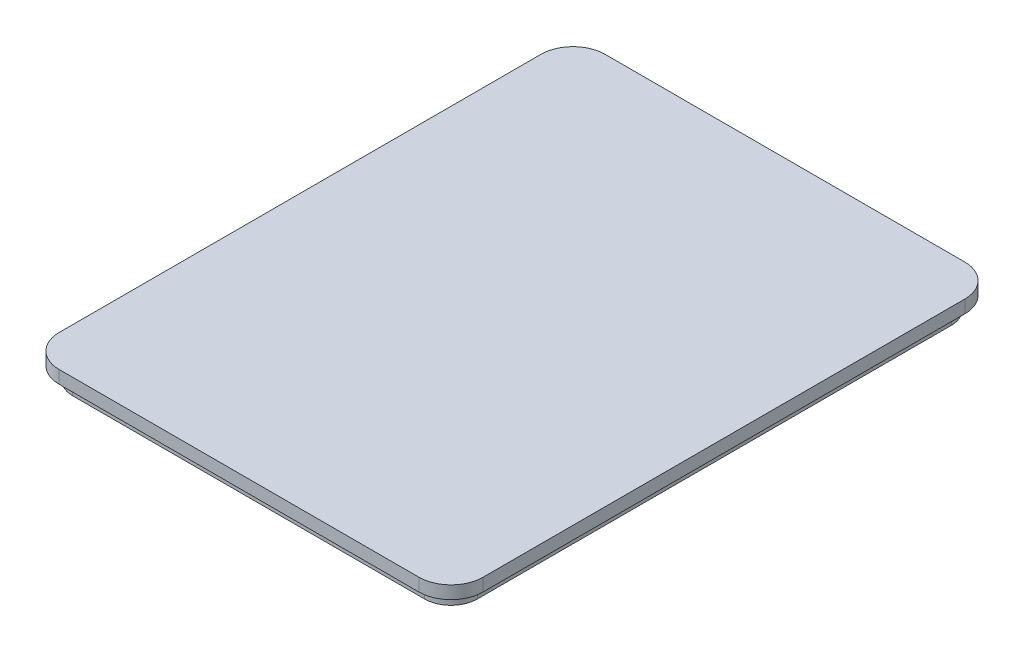
ISO-10303-21;
HEADER;
FILE_DESCRIPTION(('STEP AP214'),'2;1');
FILE_NAME('part.step','',(''),(''),'','','');
FILE_SCHEMA(('AUTOMOTIVE_DESIGN { 1 0 10303 214 1 1 1 1 }'));
ENDSEC;
DATA;
#1=APPLICATION_CONTEXT('core data for automotive mechanical design processes');
#2=APPLICATION_PROTOCOL_DEFINITION('international standard','automotive_design',2000,#1);
#3=PRODUCT_CONTEXT('',#1,'mechanical');
#4=PRODUCT('Part','Part','',(#3));
#5=PRODUCT_RELATED_PRODUCT_CATEGORY('part','',(#4));
#6=PRODUCT_DEFINITION_FORMATION('','',#4);
#7=PRODUCT_DEFINITION_CONTEXT('part definition',#1,'design');
#8=PRODUCT_DEFINITION('design','',#6,#7);
#9=PRODUCT_DEFINITION_SHAPE('','',#8);
#10=(LENGTH_UNIT() NAMED_UNIT(*) SI_UNIT(.MILLI.,.METRE.));
#11=(NAMED_UNIT(*) PLANE_ANGLE_UNIT() SI_UNIT($,.RADIAN.));
#12=(NAMED_UNIT(*) SI_UNIT($,.STERADIAN.) SOLID_ANGLE_UNIT());
#13=UNCERTAINTY_MEASURE_WITH_UNIT(LENGTH_MEASURE(1.E-05),#10,'distance_accuracy_value','');
#14=(GEOMETRIC_REPRESENTATION_CONTEXT(3) GLOBAL_UNCERTAINTY_ASSIGNED_CONTEXT((#13)) GLOBAL_UNIT_ASSIGNED_CONTEXT((#10,
#11,#12)) REPRESENTATION_CONTEXT('',''));
#15=CARTESIAN_POINT('',(0.,0.,0.));
#16=DIRECTION('',(0.,0.,1.));
#17=DIRECTION('',(1.,0.,0.));
#18=AXIS2_PLACEMENT_3D('',#15,#16,#17);
#19=CARTESIAN_POINT('',(5.,0.,-5.));
#20=DIRECTION('',(0.,1.,0.));
#21=DIRECTION('',(0.,0.,1.));
#22=AXIS2_PLACEMENT_3D('',#19,#20,#21);
#23=PLANE('',#22);
#24=CARTESIAN_POINT('',(5.,0.,-5.));
#25=DIRECTION('',(0.,1.,0.));
#26=DIRECTION('',(0.,0.,1.));
#27=AXIS2_PLACEMENT_3D('',#24,#25,#26);
#28=CIRCLE('',#27,5.);
#29=CARTESIAN_POINT('',(0.,0.,-5.00000000000004));
#30=VERTEX_POINT('',#29);
#31=CARTESIAN_POINT('',(5.00000000000004,0.,0.));
#32=VERTEX_POINT('',#31);
#33=EDGE_CURVE('E170',#30,#32,#28,.T.);
#34=ORIENTED_EDGE('',*,*,#33,.F.);
#35=DIRECTION('',(0.,0.,1.));
#36=VECTOR('',#35,1.);
#37=CARTESIAN_POINT('',(0.,0.,-5.00000000000004));
#38=LINE('',#37,#36);
#39=CARTESIAN_POINT('',(0.,0.,-80.));
#40=VERTEX_POINT('',#39);
#41=EDGE_CURVE('E183',#40,#30,#38,.T.);
#42=ORIENTED_EDGE('',*,*,#41,.F.);
#43=CARTESIAN_POINT('',(5.,0.,-80.));
#44=DIRECTION('',(0.,1.,0.));
#45=DIRECTION('',(0.,0.,1.));
#46=AXIS2_PLACEMENT_3D('',#43,#44,#45);
#47=CIRCLE('',#46,5.);
#48=CARTESIAN_POINT('',(5.00000000000004,0.,-85.));
#49=VERTEX_POINT('',#48);
#50=EDGE_CURVE('E207',#49,#40,#47,.T.);
#51=ORIENTED_EDGE('',*,*,#50,.F.);
#52=DIRECTION('',(-1.,0.,0.));
#53=VECTOR('',#52,1.);
#54=CARTESIAN_POINT('',(5.00000000000004,0.,-85.));
#55=LINE('',#54,#53);
#56=CARTESIAN_POINT('',(61.,0.,-85.));
#57=VERTEX_POINT('',#56);
#58=EDGE_CURVE('E205',#57,#49,#55,.T.);
#59=ORIENTED_EDGE('',*,*,#58,.F.);
#60=CARTESIAN_POINT('',(61.,0.,-80.));
#61=DIRECTION('',(0.,1.,0.));
#62=DIRECTION('',(0.,0.,1.));
#63=AXIS2_PLACEMENT_3D('',#60,#61,#62);
#64=CIRCLE('',#63,5.);
#65=CARTESIAN_POINT('',(66.,0.,-80.));
#66=VERTEX_POINT('',#65);
#67=EDGE_CURVE('E203',#66,#57,#64,.T.);
#68=ORIENTED_EDGE('',*,*,#67,.F.);
#69=DIRECTION('',(0.,0.,-1.));
#70=VECTOR('',#69,1.);
#71=CARTESIAN_POINT('',(66.,0.,-5.00000000000004));
#72=LINE('',#71,#70);
#73=CARTESIAN_POINT('',(66.,0.,-5.00000000000004));
#74=VERTEX_POINT('',#73);
#75=EDGE_CURVE('E201',#74,#66,#72,.T.);
#76=ORIENTED_EDGE('',*,*,#75,.F.);
#77=CARTESIAN_POINT('',(61.,0.,-5.));
#78=DIRECTION('',(0.,1.,0.));
#79=DIRECTION('',(0.,0.,1.));
#80=AXIS2_PLACEMENT_3D('',#77,#78,#79);
#81=CIRCLE('',#80,5.);
#82=CARTESIAN_POINT('',(61.,0.,0.));
#83=VERTEX_POINT('',#82);
#84=EDGE_CURVE('E199',#83,#74,#81,.T.);
#85=ORIENTED_EDGE('',*,*,#84,.F.);
#86=DIRECTION('',(1.,0.,0.));
#87=VECTOR('',#86,1.);
#88=CARTESIAN_POINT('',(5.00000000000004,0.,0.));
#89=LINE('',#88,#87);
#90=EDGE_CURVE('E173',#32,#83,#89,.T.);
#91=ORIENTED_EDGE('',*,*,#90,.F.);
#92=EDGE_LOOP('',(#34,#42,#51,#59,#68,#76,#85,#91));
#93=FACE_BOUND('',#92,.T.);
#94=CARTESIAN_POINT('',(60.3939237044739,0.,-5.60607629552614));
#95=DIRECTION('',(0.,-1.,0.));
#96=DIRECTION('',(0.,0.,-1.));
#97=AXIS2_PLACEMENT_3D('',#94,#95,#96);
#98=CIRCLE('',#97,4.10607629552614);
#99=CARTESIAN_POINT('',(64.5,0.,-5.60607629552614));
#100=VERTEX_POINT('',#99);
#101=CARTESIAN_POINT('',(60.3939237044739,0.,-1.5));
#102=VERTEX_POINT('',#101);
#103=EDGE_CURVE('E52',#100,#102,#98,.T.);
#104=ORIENTED_EDGE('',*,*,#103,.F.);
#105=DIRECTION('',(0.,0.,1.));
#106=VECTOR('',#105,1.);
#107=CARTESIAN_POINT('',(64.5,0.,-79.3939237044739));
#108=LINE('',#107,#106);
#109=CARTESIAN_POINT('',(64.5,0.,-79.3939237044739));
#110=VERTEX_POINT('',#109);
#111=EDGE_CURVE('E56',#110,#100,#108,.T.);
#112=ORIENTED_EDGE('',*,*,#111,.F.);
#113=CARTESIAN_POINT('',(60.3939237044739,0.,-79.3939237044739));
#114=DIRECTION('',(0.,-1.,0.));
#115=DIRECTION('',(0.,0.,1.));
#116=AXIS2_PLACEMENT_3D('',#113,#114,#115);
#117=CIRCLE('',#116,4.10607629552615);
#118=CARTESIAN_POINT('',(60.3939237044739,0.,-83.5));
#119=VERTEX_POINT('',#118);
#120=EDGE_CURVE('E471',#119,#110,#117,.T.);
#121=ORIENTED_EDGE('',*,*,#120,.F.);
#122=DIRECTION('',(1.,0.,0.));
#123=VECTOR('',#122,1.);
#124=CARTESIAN_POINT('',(60.3939237044739,0.,-83.5));
#125=LINE('',#124,#123);
#126=CARTESIAN_POINT('',(5.60607629552614,0.,-83.5));
#127=VERTEX_POINT('',#126);
#128=EDGE_CURVE('E505',#127,#119,#125,.T.);
#129=ORIENTED_EDGE('',*,*,#128,.F.);
#130=CARTESIAN_POINT('',(5.60607629552614,0.,-79.3939237044739));
#131=DIRECTION('',(0.,-1.,0.));
#132=DIRECTION('',(0.,0.,-1.));
#133=AXIS2_PLACEMENT_3D('',#130,#131,#132);
#134=CIRCLE('',#133,4.10607629552615);
#135=CARTESIAN_POINT('',(1.49999999999999,0.,-79.3939237044739));
#136=VERTEX_POINT('',#135);
#137=EDGE_CURVE('E498',#136,#127,#134,.T.);
#138=ORIENTED_EDGE('',*,*,#137,.F.);
#139=DIRECTION('',(0.,0.,-1.));
#140=VECTOR('',#139,1.);
#141=CARTESIAN_POINT('',(1.5,0.,-79.3939237044739));
#142=LINE('',#141,#140);
#143=CARTESIAN_POINT('',(1.5,0.,-5.60607629552615));
#144=VERTEX_POINT('',#143);
#145=EDGE_CURVE('E492',#144,#136,#142,.T.);
#146=ORIENTED_EDGE('',*,*,#145,.F.);
#147=CARTESIAN_POINT('',(5.60607629552614,0.,-5.60607629552615));
#148=DIRECTION('',(0.,-1.,0.));
#149=DIRECTION('',(0.,0.,-1.));
#150=AXIS2_PLACEMENT_3D('',#147,#148,#149);
#151=CIRCLE('',#150,4.10607629552614);
#152=CARTESIAN_POINT('',(5.60607629552614,0.,-1.50000000000001));
#153=VERTEX_POINT('',#152);
#154=EDGE_CURVE('E495',#153,#144,#151,.T.);
#155=ORIENTED_EDGE('',*,*,#154,.F.);
#156=DIRECTION('',(-1.,0.,0.));
#157=VECTOR('',#156,1.);
#158=CARTESIAN_POINT('',(60.3939237044739,0.,-1.5));
#159=LINE('',#158,#157);
#160=EDGE_CURVE('E496',#102,#153,#159,.T.);
#161=ORIENTED_EDGE('',*,*,#160,.F.);
#162=EDGE_LOOP('',(#104,#112,#121,#129,#138,#146,#155,#161));
#163=FACE_BOUND('',#162,.T.);
#164=ADVANCED_FACE('F37',(#93,#163),#23,.F.);
#165=CARTESIAN_POINT('',(5.,2.,-5.));
#166=DIRECTION('',(0.,-1.,0.));
#167=DIRECTION('',(0.,0.,-1.));
#168=AXIS2_PLACEMENT_3D('',#165,#166,#167);
#169=CYLINDRICAL_SURFACE('',#168,5.);
#170=ORIENTED_EDGE('',*,*,#33,.T.);
#171=DIRECTION('',(0.,-1.,0.));
#172=VECTOR('',#171,1.);
#173=CARTESIAN_POINT('',(5.00000000000004,2.,0.));
#174=LINE('',#173,#172);
#175=CARTESIAN_POINT('',(5.00000000000004,2.,0.));
#176=VERTEX_POINT('',#175);
#177=EDGE_CURVE('E11',#176,#32,#174,.T.);
#178=ORIENTED_EDGE('',*,*,#177,.F.);
#179=CARTESIAN_POINT('',(5.,2.,-5.));
#180=DIRECTION('',(0.,1.,0.));
#181=DIRECTION('',(0.,0.,1.));
#182=AXIS2_PLACEMENT_3D('',#179,#180,#181);
#183=CIRCLE('',#182,5.);
#184=CARTESIAN_POINT('',(0.,2.,-5.00000000000004));
#185=VERTEX_POINT('',#184);
#186=EDGE_CURVE('E179',#185,#176,#183,.T.);
#187=ORIENTED_EDGE('',*,*,#186,.F.);
#188=DIRECTION('',(0.,-1.,0.));
#189=VECTOR('',#188,1.);
#190=CARTESIAN_POINT('',(0.,2.,-5.00000000000004));
#191=LINE('',#190,#189);
#192=EDGE_CURVE('E196',#185,#30,#191,.T.);
#193=ORIENTED_EDGE('',*,*,#192,.T.);
#194=EDGE_LOOP('',(#170,#178,#187,#193));
#195=FACE_BOUND('',#194,.T.);
#196=ADVANCED_FACE('F39',(#195),#169,.T.);
#197=CARTESIAN_POINT('',(5.00000000000004,2.,0.));
#198=DIRECTION('',(0.,0.,-1.));
#199=DIRECTION('',(-1.,0.,0.));
#200=AXIS2_PLACEMENT_3D('',#197,#198,#199);
#201=PLANE('',#200);
#202=ORIENTED_EDGE('',*,*,#90,.T.);
#203=DIRECTION('',(0.,-1.,0.));
#204=VECTOR('',#203,1.);
#205=CARTESIAN_POINT('',(61.,2.,0.));
#206=LINE('',#205,#204);
#207=CARTESIAN_POINT('',(61.,2.,0.));
#208=VERTEX_POINT('',#207);
#209=EDGE_CURVE('E45',#208,#83,#206,.T.);
#210=ORIENTED_EDGE('',*,*,#209,.F.);
#211=DIRECTION('',(1.,0.,0.));
#212=VECTOR('',#211,1.);
#213=CARTESIAN_POINT('',(5.00000000000004,2.,0.));
#214=LINE('',#213,#212);
#215=EDGE_CURVE('E182',#176,#208,#214,.T.);
#216=ORIENTED_EDGE('',*,*,#215,.F.);
#217=ORIENTED_EDGE('',*,*,#177,.T.);
#218=EDGE_LOOP('',(#202,#210,#216,#217));
#219=FACE_BOUND('',#218,.T.);
#220=ADVANCED_FACE('F253',(#219),#201,.F.);
#221=CARTESIAN_POINT('',(61.,2.,-5.));
#222=DIRECTION('',(0.,-1.,0.));
#223=DIRECTION('',(0.,0.,-1.));
#224=AXIS2_PLACEMENT_3D('',#221,#222,#223);
#225=CYLINDRICAL_SURFACE('',#224,5.);
#226=ORIENTED_EDGE('',*,*,#84,.T.);
#227=DIRECTION('',(0.,-1.,0.));
#228=VECTOR('',#227,1.);
#229=CARTESIAN_POINT('',(66.,2.,-5.00000000000004));
#230=LINE('',#229,#228);
#231=CARTESIAN_POINT('',(66.,2.,-5.00000000000004));
#232=VERTEX_POINT('',#231);
#233=EDGE_CURVE('E224',#232,#74,#230,.T.);
#234=ORIENTED_EDGE('',*,*,#233,.F.);
#235=CARTESIAN_POINT('',(61.,2.,-5.));
#236=DIRECTION('',(0.,1.,0.));
#237=DIRECTION('',(0.,0.,1.));
#238=AXIS2_PLACEMENT_3D('',#235,#236,#237);
#239=CIRCLE('',#238,5.);
#240=EDGE_CURVE('E185',#208,#232,#239,.T.);
#241=ORIENTED_EDGE('',*,*,#240,.F.);
#242=ORIENTED_EDGE('',*,*,#209,.T.);
#243=EDGE_LOOP('',(#226,#234,#241,#242));
#244=FACE_BOUND('',#243,.T.);
#245=ADVANCED_FACE('F231',(#244),#225,.T.);
#246=CARTESIAN_POINT('',(66.,2.,-5.00000000000004));
#247=DIRECTION('',(-1.,0.,0.));
#248=DIRECTION('',(0.,0.,1.));
#249=AXIS2_PLACEMENT_3D('',#246,#247,#248);
#250=PLANE('',#249);
#251=ORIENTED_EDGE('',*,*,#75,.T.);
#252=DIRECTION('',(0.,-1.,0.));
#253=VECTOR('',#252,1.);
#254=CARTESIAN_POINT('',(66.,2.,-80.));
#255=LINE('',#254,#253);
#256=CARTESIAN_POINT('',(66.,2.,-80.));
#257=VERTEX_POINT('',#256);
#258=EDGE_CURVE('E221',#257,#66,#255,.T.);
#259=ORIENTED_EDGE('',*,*,#258,.F.);
#260=DIRECTION('',(0.,0.,-1.));
#261=VECTOR('',#260,1.);
#262=CARTESIAN_POINT('',(66.,2.,-5.00000000000004));
#263=LINE('',#262,#261);
#264=EDGE_CURVE('E187',#232,#257,#263,.T.);
#265=ORIENTED_EDGE('',*,*,#264,.F.);
#266=ORIENTED_EDGE('',*,*,#233,.T.);
#267=EDGE_LOOP('',(#251,#259,#265,#266));
#268=FACE_BOUND('',#267,.T.);
#269=ADVANCED_FACE('F241',(#268),#250,.F.);
#270=CARTESIAN_POINT('',(61.,2.,-80.));
#271=DIRECTION('',(0.,-1.,0.));
#272=DIRECTION('',(0.,0.,-1.));
#273=AXIS2_PLACEMENT_3D('',#270,#271,#272);
#274=CYLINDRICAL_SURFACE('',#273,5.);
#275=ORIENTED_EDGE('',*,*,#67,.T.);
#276=DIRECTION('',(0.,-1.,0.));
#277=VECTOR('',#276,1.);
#278=CARTESIAN_POINT('',(61.,2.,-85.));
#279=LINE('',#278,#277);
#280=CARTESIAN_POINT('',(61.,2.,-85.));
#281=VERTEX_POINT('',#280);
#282=EDGE_CURVE('E218',#281,#57,#279,.T.);
#283=ORIENTED_EDGE('',*,*,#282,.F.);
#284=CARTESIAN_POINT('',(61.,2.,-80.));
#285=DIRECTION('',(0.,1.,0.));
#286=DIRECTION('',(0.,0.,1.));
#287=AXIS2_PLACEMENT_3D('',#284,#285,#286);
#288=CIRCLE('',#287,5.);
#289=EDGE_CURVE('E189',#257,#281,#288,.T.);
#290=ORIENTED_EDGE('',*,*,#289,.F.);
#291=ORIENTED_EDGE('',*,*,#258,.T.);
#292=EDGE_LOOP('',(#275,#283,#290,#291));
#293=FACE_BOUND('',#292,.T.);
#294=ADVANCED_FACE('F245',(#293),#274,.T.);
#295=CARTESIAN_POINT('',(5.00000000000004,2.,-85.));
#296=DIRECTION('',(0.,0.,1.));
#297=DIRECTION('',(1.,0.,0.));
#298=AXIS2_PLACEMENT_3D('',#295,#296,#297);
#299=PLANE('',#298);
#300=ORIENTED_EDGE('',*,*,#58,.T.);
#301=DIRECTION('',(0.,-1.,0.));
#302=VECTOR('',#301,1.);
#303=CARTESIAN_POINT('',(5.00000000000004,2.,-85.));
#304=LINE('',#303,#302);
#305=CARTESIAN_POINT('',(5.00000000000004,2.,-85.));
#306=VERTEX_POINT('',#305);
#307=EDGE_CURVE('E215',#306,#49,#304,.T.);
#308=ORIENTED_EDGE('',*,*,#307,.F.);
#309=DIRECTION('',(-1.,0.,0.));
#310=VECTOR('',#309,1.);
#311=CARTESIAN_POINT('',(5.00000000000004,2.,-85.));
#312=LINE('',#311,#310);
#313=EDGE_CURVE('E191',#281,#306,#312,.T.);
#314=ORIENTED_EDGE('',*,*,#313,.F.);
#315=ORIENTED_EDGE('',*,*,#282,.T.);
#316=EDGE_LOOP('',(#300,#308,#314,#315));
#317=FACE_BOUND('',#316,.T.);
#318=ADVANCED_FACE('F266',(#317),#299,.F.);
#319=CARTESIAN_POINT('',(5.,2.,-80.));
#320=DIRECTION('',(0.,-1.,0.));
#321=DIRECTION('',(0.,0.,-1.));
#322=AXIS2_PLACEMENT_3D('',#319,#320,#321);
#323=CYLINDRICAL_SURFACE('',#322,5.);
#324=ORIENTED_EDGE('',*,*,#50,.T.);
#325=DIRECTION('',(0.,-1.,0.));
#326=VECTOR('',#325,1.);
#327=CARTESIAN_POINT('',(0.,2.,-80.));
#328=LINE('',#327,#326);
#329=CARTESIAN_POINT('',(0.,2.,-80.));
#330=VERTEX_POINT('',#329);
#331=EDGE_CURVE('E212',#330,#40,#328,.T.);
#332=ORIENTED_EDGE('',*,*,#331,.F.);
#333=CARTESIAN_POINT('',(5.,2.,-80.));
#334=DIRECTION('',(0.,1.,0.));
#335=DIRECTION('',(0.,0.,1.));
#336=AXIS2_PLACEMENT_3D('',#333,#334,#335);
#337=CIRCLE('',#336,5.);
#338=EDGE_CURVE('E193',#306,#330,#337,.T.);
#339=ORIENTED_EDGE('',*,*,#338,.F.);
#340=ORIENTED_EDGE('',*,*,#307,.T.);
#341=EDGE_LOOP('',(#324,#332,#339,#340));
#342=FACE_BOUND('',#341,.T.);
#343=ADVANCED_FACE('F264',(#342),#323,.T.);
#344=CARTESIAN_POINT('',(0.,2.,-5.00000000000004));
#345=DIRECTION('',(1.,0.,0.));
#346=DIRECTION('',(0.,0.,-1.));
#347=AXIS2_PLACEMENT_3D('',#344,#345,#346);
#348=PLANE('',#347);
#349=ORIENTED_EDGE('',*,*,#41,.T.);
#350=ORIENTED_EDGE('',*,*,#192,.F.);
#351=DIRECTION('',(0.,0.,1.));
#352=VECTOR('',#351,1.);
#353=CARTESIAN_POINT('',(0.,2.,-5.00000000000004));
#354=LINE('',#353,#352);
#355=EDGE_CURVE('E195',#330,#185,#354,.T.);
#356=ORIENTED_EDGE('',*,*,#355,.F.);
#357=ORIENTED_EDGE('',*,*,#331,.T.);
#358=EDGE_LOOP('',(#349,#350,#356,#357));
#359=FACE_BOUND('',#358,.T.);
#360=ADVANCED_FACE('F259',(#359),#348,.F.);
#361=CARTESIAN_POINT('',(5.,2.,-5.));
#362=DIRECTION('',(0.,1.,0.));
#363=DIRECTION('',(0.,0.,1.));
#364=AXIS2_PLACEMENT_3D('',#361,#362,#363);
#365=PLANE('',#364);
#366=ORIENTED_EDGE('',*,*,#186,.T.);
#367=ORIENTED_EDGE('',*,*,#215,.T.);
#368=ORIENTED_EDGE('',*,*,#240,.T.);
#369=ORIENTED_EDGE('',*,*,#264,.T.);
#370=ORIENTED_EDGE('',*,*,#289,.T.);
#371=ORIENTED_EDGE('',*,*,#313,.T.);
#372=ORIENTED_EDGE('',*,*,#338,.T.);
#373=ORIENTED_EDGE('',*,*,#355,.T.);
#374=EDGE_LOOP('',(#366,#367,#368,#369,#370,#371,#372,#373));
#375=FACE_BOUND('',#374,.T.);
#376=ADVANCED_FACE('F249',(#375),#365,.T.);
#377=CARTESIAN_POINT('',(60.3939237044739,-2.,-5.60607629552614));
#378=DIRECTION('',(0.,1.,0.));
#379=DIRECTION('',(0.,0.,1.));
#380=AXIS2_PLACEMENT_3D('',#377,#378,#379);
#381=CYLINDRICAL_SURFACE('',#380,4.10607629552614);
#382=ORIENTED_EDGE('',*,*,#103,.T.);
#383=DIRECTION('',(0.,1.,0.));
#384=VECTOR('',#383,1.);
#385=CARTESIAN_POINT('',(60.3939237044739,-2.,-1.5));
#386=LINE('',#385,#384);
#387=CARTESIAN_POINT('',(60.3939237044739,-2.,-1.5));
#388=VERTEX_POINT('',#387);
#389=EDGE_CURVE('E153',#388,#102,#386,.T.);
#390=ORIENTED_EDGE('',*,*,#389,.F.);
#391=CARTESIAN_POINT('',(60.3939237044739,-2.,-5.60607629552614));
#392=DIRECTION('',(0.,-1.,0.));
#393=DIRECTION('',(0.,0.,-1.));
#394=AXIS2_PLACEMENT_3D('',#391,#392,#393);
#395=CIRCLE('',#394,4.10607629552614);
#396=CARTESIAN_POINT('',(64.5,-2.,-5.60607629552614));
#397=VERTEX_POINT('',#396);
#398=EDGE_CURVE('E159',#397,#388,#395,.T.);
#399=ORIENTED_EDGE('',*,*,#398,.F.);
#400=DIRECTION('',(0.,1.,0.));
#401=VECTOR('',#400,1.);
#402=CARTESIAN_POINT('',(64.5,-2.,-5.60607629552614));
#403=LINE('',#402,#401);
#404=EDGE_CURVE('E468',#397,#100,#403,.T.);
#405=ORIENTED_EDGE('',*,*,#404,.T.);
#406=EDGE_LOOP('',(#382,#390,#399,#405));
#407=FACE_BOUND('',#406,.T.);
#408=ADVANCED_FACE('F169',(#407),#381,.T.);
#409=CARTESIAN_POINT('',(60.3939237044739,-2.,-1.5));
#410=DIRECTION('',(0.,0.,-1.));
#411=DIRECTION('',(-1.,0.,0.));
#412=AXIS2_PLACEMENT_3D('',#409,#410,#411);
#413=PLANE('',#412);
#414=ORIENTED_EDGE('',*,*,#160,.T.);
#415=DIRECTION('',(0.,1.,0.));
#416=VECTOR('',#415,1.);
#417=CARTESIAN_POINT('',(5.60607629552614,-2.,-1.50000000000001));
#418=LINE('',#417,#416);
#419=CARTESIAN_POINT('',(5.60607629552614,-2.,-1.50000000000001));
#420=VERTEX_POINT('',#419);
#421=EDGE_CURVE('E155',#420,#153,#418,.T.);
#422=ORIENTED_EDGE('',*,*,#421,.F.);
#423=DIRECTION('',(-1.,0.,0.));
#424=VECTOR('',#423,1.);
#425=CARTESIAN_POINT('',(60.3939237044739,-2.,-1.5));
#426=LINE('',#425,#424);
#427=EDGE_CURVE('E148',#388,#420,#426,.T.);
#428=ORIENTED_EDGE('',*,*,#427,.F.);
#429=ORIENTED_EDGE('',*,*,#389,.T.);
#430=EDGE_LOOP('',(#414,#422,#428,#429));
#431=FACE_BOUND('',#430,.T.);
#432=ADVANCED_FACE('F151',(#431),#413,.F.);
#433=CARTESIAN_POINT('',(5.60607629552614,-2.,-5.60607629552615));
#434=DIRECTION('',(0.,1.,0.));
#435=DIRECTION('',(0.,0.,1.));
#436=AXIS2_PLACEMENT_3D('',#433,#434,#435);
#437=CYLINDRICAL_SURFACE('',#436,4.10607629552614);
#438=ORIENTED_EDGE('',*,*,#154,.T.);
#439=DIRECTION('',(0.,1.,0.));
#440=VECTOR('',#439,1.);
#441=CARTESIAN_POINT('',(1.5,-2.,-5.60607629552615));
#442=LINE('',#441,#440);
#443=CARTESIAN_POINT('',(1.5,-2.,-5.60607629552615));
#444=VERTEX_POINT('',#443);
#445=EDGE_CURVE('E175',#444,#144,#442,.T.);
#446=ORIENTED_EDGE('',*,*,#445,.F.);
#447=CARTESIAN_POINT('',(5.60607629552614,-2.,-5.60607629552615));
#448=DIRECTION('',(0.,-1.,0.));
#449=DIRECTION('',(0.,0.,-1.));
#450=AXIS2_PLACEMENT_3D('',#447,#448,#449);
#451=CIRCLE('',#450,4.10607629552614);
#452=EDGE_CURVE('E158',#420,#444,#451,.T.);
#453=ORIENTED_EDGE('',*,*,#452,.F.);
#454=ORIENTED_EDGE('',*,*,#421,.T.);
#455=EDGE_LOOP('',(#438,#446,#453,#454));
#456=FACE_BOUND('',#455,.T.);
#457=ADVANCED_FACE('F293',(#456),#437,.T.);
#458=CARTESIAN_POINT('',(1.5,-2.,-79.3939237044739));
#459=DIRECTION('',(1.,0.,0.));
#460=DIRECTION('',(0.,0.,-1.));
#461=AXIS2_PLACEMENT_3D('',#458,#459,#460);
#462=PLANE('',#461);
#463=ORIENTED_EDGE('',*,*,#145,.T.);
#464=DIRECTION('',(0.,1.,0.));
#465=VECTOR('',#464,1.);
#466=CARTESIAN_POINT('',(1.49999999999999,-2.,-79.3939237044739));
#467=LINE('',#466,#465);
#468=CARTESIAN_POINT('',(1.49999999999999,-2.,-79.3939237044739));
#469=VERTEX_POINT('',#468);
#470=EDGE_CURVE('E485',#469,#136,#467,.T.);
#471=ORIENTED_EDGE('',*,*,#470,.F.);
#472=DIRECTION('',(0.,0.,-1.));
#473=VECTOR('',#472,1.);
#474=CARTESIAN_POINT('',(1.5,-2.,-79.3939237044739));
#475=LINE('',#474,#473);
#476=EDGE_CURVE('E493',#444,#469,#475,.T.);
#477=ORIENTED_EDGE('',*,*,#476,.F.);
#478=ORIENTED_EDGE('',*,*,#445,.T.);
#479=EDGE_LOOP('',(#463,#471,#477,#478));
#480=FACE_BOUND('',#479,.T.);
#481=ADVANCED_FACE('F298',(#480),#462,.F.);
#482=CARTESIAN_POINT('',(5.60607629552614,-2.,-79.3939237044739));
#483=DIRECTION('',(0.,1.,0.));
#484=DIRECTION('',(0.,0.,1.));
#485=AXIS2_PLACEMENT_3D('',#482,#483,#484);
#486=CYLINDRICAL_SURFACE('',#485,4.10607629552615);
#487=ORIENTED_EDGE('',*,*,#137,.T.);
#488=DIRECTION('',(0.,1.,0.));
#489=VECTOR('',#488,1.);
#490=CARTESIAN_POINT('',(5.60607629552614,-2.,-83.5));
#491=LINE('',#490,#489);
#492=CARTESIAN_POINT('',(5.60607629552614,-2.,-83.5));
#493=VERTEX_POINT('',#492);
#494=EDGE_CURVE('E482',#493,#127,#491,.T.);
#495=ORIENTED_EDGE('',*,*,#494,.F.);
#496=CARTESIAN_POINT('',(5.60607629552614,-2.,-79.3939237044739));
#497=DIRECTION('',(0.,-1.,0.));
#498=DIRECTION('',(0.,0.,-1.));
#499=AXIS2_PLACEMENT_3D('',#496,#497,#498);
#500=CIRCLE('',#499,4.10607629552615);
#501=EDGE_CURVE('E513',#469,#493,#500,.T.);
#502=ORIENTED_EDGE('',*,*,#501,.F.);
#503=ORIENTED_EDGE('',*,*,#470,.T.);
#504=EDGE_LOOP('',(#487,#495,#502,#503));
#505=FACE_BOUND('',#504,.T.);
#506=ADVANCED_FACE('F302',(#505),#486,.T.);
#507=CARTESIAN_POINT('',(60.3939237044739,-2.,-83.5));
#508=DIRECTION('',(0.,0.,1.));
#509=DIRECTION('',(1.,0.,0.));
#510=AXIS2_PLACEMENT_3D('',#507,#508,#509);
#511=PLANE('',#510);
#512=ORIENTED_EDGE('',*,*,#128,.T.);
#513=DIRECTION('',(0.,1.,0.));
#514=VECTOR('',#513,1.);
#515=CARTESIAN_POINT('',(60.3939237044739,-2.,-83.5));
#516=LINE('',#515,#514);
#517=CARTESIAN_POINT('',(60.3939237044739,-2.,-83.5));
#518=VERTEX_POINT('',#517);
#519=EDGE_CURVE('E474',#518,#119,#516,.T.);
#520=ORIENTED_EDGE('',*,*,#519,.F.);
#521=DIRECTION('',(1.,0.,0.));
#522=VECTOR('',#521,1.);
#523=CARTESIAN_POINT('',(60.3939237044739,-2.,-83.5));
#524=LINE('',#523,#522);
#525=EDGE_CURVE('E511',#493,#518,#524,.T.);
#526=ORIENTED_EDGE('',*,*,#525,.F.);
#527=ORIENTED_EDGE('',*,*,#494,.T.);
#528=EDGE_LOOP('',(#512,#520,#526,#527));
#529=FACE_BOUND('',#528,.T.);
#530=ADVANCED_FACE('F306',(#529),#511,.F.);
#531=CARTESIAN_POINT('',(60.3939237044739,-2.,-79.3939237044739));
#532=DIRECTION('',(0.,1.,0.));
#533=DIRECTION('',(0.,0.,1.));
#534=AXIS2_PLACEMENT_3D('',#531,#532,#533);
#535=CYLINDRICAL_SURFACE('',#534,4.10607629552615);
#536=ORIENTED_EDGE('',*,*,#120,.T.);
#537=DIRECTION('',(0.,1.,0.));
#538=VECTOR('',#537,1.);
#539=CARTESIAN_POINT('',(64.5,-2.,-79.3939237044739));
#540=LINE('',#539,#538);
#541=CARTESIAN_POINT('',(64.5,-2.,-79.3939237044739));
#542=VERTEX_POINT('',#541);
#543=EDGE_CURVE('E470',#542,#110,#540,.T.);
#544=ORIENTED_EDGE('',*,*,#543,.F.);
#545=CARTESIAN_POINT('',(60.3939237044739,-2.,-79.3939237044739));
#546=DIRECTION('',(0.,-1.,0.));
#547=DIRECTION('',(0.,0.,1.));
#548=AXIS2_PLACEMENT_3D('',#545,#546,#547);
#549=CIRCLE('',#548,4.10607629552615);
#550=EDGE_CURVE('E476',#518,#542,#549,.T.);
#551=ORIENTED_EDGE('',*,*,#550,.F.);
#552=ORIENTED_EDGE('',*,*,#519,.T.);
#553=EDGE_LOOP('',(#536,#544,#551,#552));
#554=FACE_BOUND('',#553,.T.);
#555=ADVANCED_FACE('F310',(#554),#535,.T.);
#556=CARTESIAN_POINT('',(64.5,-2.,-79.3939237044739));
#557=DIRECTION('',(-1.,0.,0.));
#558=DIRECTION('',(0.,0.,1.));
#559=AXIS2_PLACEMENT_3D('',#556,#557,#558);
#560=PLANE('',#559);
#561=ORIENTED_EDGE('',*,*,#111,.T.);
#562=ORIENTED_EDGE('',*,*,#404,.F.);
#563=DIRECTION('',(0.,0.,1.));
#564=VECTOR('',#563,1.);
#565=CARTESIAN_POINT('',(64.5,-2.,-79.3939237044739));
#566=LINE('',#565,#564);
#567=EDGE_CURVE('E164',#542,#397,#566,.T.);
#568=ORIENTED_EDGE('',*,*,#567,.F.);
#569=ORIENTED_EDGE('',*,*,#543,.T.);
#570=EDGE_LOOP('',(#561,#562,#568,#569));
#571=FACE_BOUND('',#570,.T.);
#572=ADVANCED_FACE('F314',(#571),#560,.F.);
#573=CARTESIAN_POINT('',(60.3939237044739,-2.,-5.60607629552614));
#574=DIRECTION('',(0.,-1.,0.));
#575=DIRECTION('',(0.,0.,-1.));
#576=AXIS2_PLACEMENT_3D('',#573,#574,#575);
#577=PLANE('',#576);
#578=ORIENTED_EDGE('',*,*,#398,.T.);
#579=ORIENTED_EDGE('',*,*,#427,.T.);
#580=ORIENTED_EDGE('',*,*,#452,.T.);
#581=ORIENTED_EDGE('',*,*,#476,.T.);
#582=ORIENTED_EDGE('',*,*,#501,.T.);
#583=ORIENTED_EDGE('',*,*,#525,.T.);
#584=ORIENTED_EDGE('',*,*,#550,.T.);
#585=ORIENTED_EDGE('',*,*,#567,.T.);
#586=EDGE_LOOP('',(#578,#579,#580,#581,#582,#583,#584,#585));
#587=FACE_BOUND('',#586,.T.);
#588=ADVANCED_FACE('F162',(#587),#577,.T.);
#589=CLOSED_SHELL('',(#164,#196,#220,#245,#269,#294,#318,#343,#360,#376,#408,#432,#457,#481,
#506,#530,#555,#572,#588));
#590=MANIFOLD_SOLID_BREP('B2',#589);
#591=ADVANCED_BREP_SHAPE_REPRESENTATION('',(#18,#590),#14);
#592=SHAPE_DEFINITION_REPRESENTATION(#9,#591);
ENDSEC;
END-ISO-10303-21;
